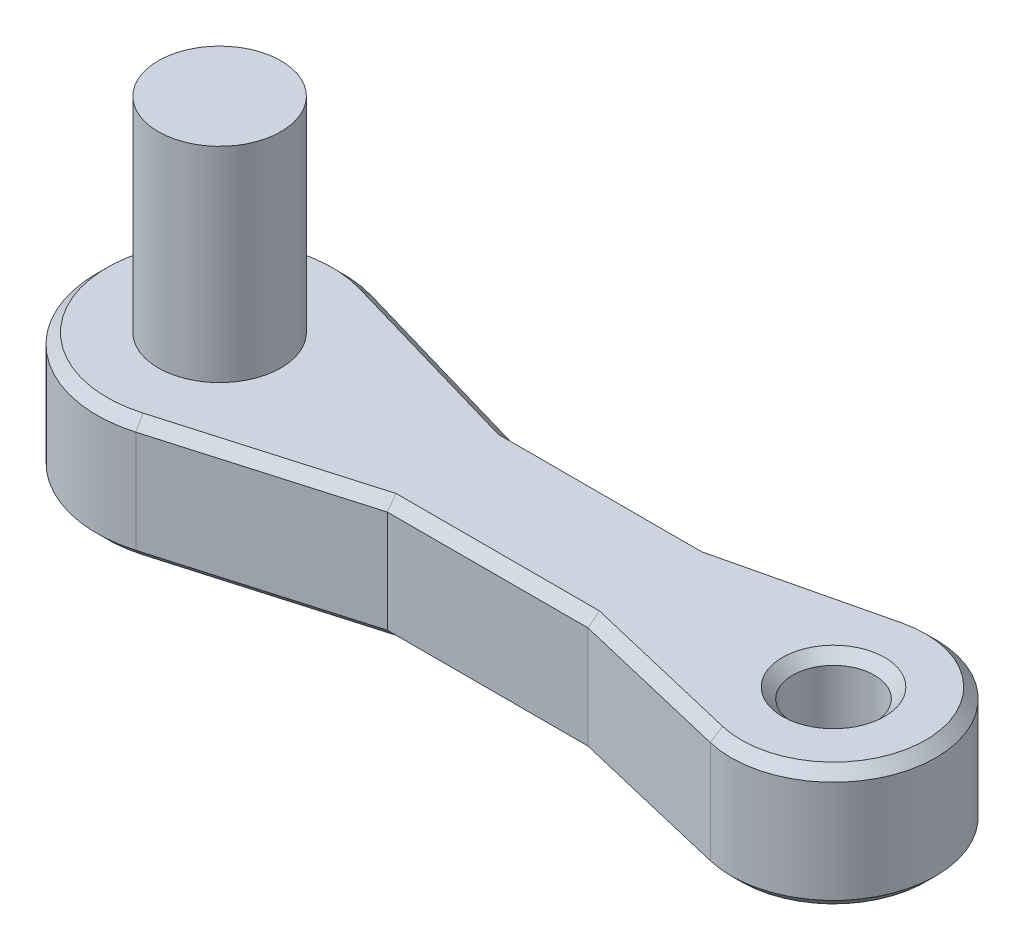
ISO-10303-21;
HEADER;
FILE_DESCRIPTION(('STEP AP214'),'2;1');
FILE_NAME('part.step','',(''),(''),'','','');
FILE_SCHEMA(('AUTOMOTIVE_DESIGN { 1 0 10303 214 1 1 1 1 }'));
ENDSEC;
DATA;
#1=APPLICATION_CONTEXT('core data for automotive mechanical design processes');
#2=APPLICATION_PROTOCOL_DEFINITION('international standard','automotive_design',2000,#1);
#3=PRODUCT_CONTEXT('',#1,'mechanical');
#4=PRODUCT('Part','Part','',(#3));
#5=PRODUCT_RELATED_PRODUCT_CATEGORY('part','',(#4));
#6=PRODUCT_DEFINITION_FORMATION('','',#4);
#7=PRODUCT_DEFINITION_CONTEXT('part definition',#1,'design');
#8=PRODUCT_DEFINITION('design','',#6,#7);
#9=PRODUCT_DEFINITION_SHAPE('','',#8);
#10=(LENGTH_UNIT() NAMED_UNIT(*) SI_UNIT(.MILLI.,.METRE.));
#11=(NAMED_UNIT(*) PLANE_ANGLE_UNIT() SI_UNIT($,.RADIAN.));
#12=(NAMED_UNIT(*) SI_UNIT($,.STERADIAN.) SOLID_ANGLE_UNIT());
#13=UNCERTAINTY_MEASURE_WITH_UNIT(LENGTH_MEASURE(1.E-05),#10,'distance_accuracy_value','');
#14=(GEOMETRIC_REPRESENTATION_CONTEXT(3) GLOBAL_UNCERTAINTY_ASSIGNED_CONTEXT((#13)) GLOBAL_UNIT_ASSIGNED_CONTEXT((#10,
#11,#12)) REPRESENTATION_CONTEXT('',''));
#15=CARTESIAN_POINT('',(0.,0.,0.));
#16=DIRECTION('',(0.,0.,1.));
#17=DIRECTION('',(1.,0.,0.));
#18=AXIS2_PLACEMENT_3D('',#15,#16,#17);
#19=CARTESIAN_POINT('',(0.,-3.,0.));
#20=DIRECTION('',(0.,1.,0.));
#21=DIRECTION('',(0.,0.,1.));
#22=AXIS2_PLACEMENT_3D('',#19,#20,#21);
#23=CYLINDRICAL_SURFACE('',#22,3.);
#24=DIRECTION('',(0.,1.,0.));
#25=VECTOR('',#24,1.);
#26=CARTESIAN_POINT('',(0.835663525696562,-7.95867495084321,2.88126126406829));
#27=LINE('',#26,#25);
#28=CARTESIAN_POINT('',(0.835663525696562,-2.75,2.88126126406829));
#29=VERTEX_POINT('',#28);
#30=CARTESIAN_POINT('',(0.835663525696562,-0.25,2.88126126406829));
#31=VERTEX_POINT('',#30);
#32=EDGE_CURVE('E187',#29,#31,#27,.T.);
#33=ORIENTED_EDGE('',*,*,#32,.T.);
#34=CARTESIAN_POINT('',(0.,-0.25,0.));
#35=DIRECTION('',(0.,1.,0.));
#36=DIRECTION('',(0.,0.,1.));
#37=AXIS2_PLACEMENT_3D('',#34,#35,#36);
#38=CIRCLE('',#37,3.);
#39=CARTESIAN_POINT('',(0.835663525696563,-0.25,-2.88126126406829));
#40=VERTEX_POINT('',#39);
#41=EDGE_CURVE('E305',#31,#40,#38,.F.);
#42=ORIENTED_EDGE('',*,*,#41,.T.);
#43=DIRECTION('',(0.,1.,0.));
#44=VECTOR('',#43,1.);
#45=CARTESIAN_POINT('',(0.835663525696563,-7.95867495084321,-2.88126126406829));
#46=LINE('',#45,#44);
#47=CARTESIAN_POINT('',(0.835663525696563,-2.75,-2.88126126406829));
#48=VERTEX_POINT('',#47);
#49=EDGE_CURVE('E304',#48,#40,#46,.T.);
#50=ORIENTED_EDGE('',*,*,#49,.F.);
#51=CARTESIAN_POINT('',(0.,-2.75,0.));
#52=DIRECTION('',(0.,1.,0.));
#53=DIRECTION('',(0.,0.,1.));
#54=AXIS2_PLACEMENT_3D('',#51,#52,#53);
#55=CIRCLE('',#54,3.);
#56=EDGE_CURVE('E301',#48,#29,#55,.T.);
#57=ORIENTED_EDGE('',*,*,#56,.T.);
#58=EDGE_LOOP('',(#33,#42,#50,#57));
#59=FACE_BOUND('',#58,.T.);
#60=ADVANCED_FACE('F41',(#59),#23,.T.);
#61=CARTESIAN_POINT('',(15.,-3.,0.));
#62=DIRECTION('',(0.,1.,0.));
#63=DIRECTION('',(0.,0.,1.));
#64=AXIS2_PLACEMENT_3D('',#61,#62,#63);
#65=CYLINDRICAL_SURFACE('',#64,2.5);
#66=DIRECTION('',(0.,1.,0.));
#67=VECTOR('',#66,1.);
#68=CARTESIAN_POINT('',(14.4218548123582,-7.03112887414927,-2.4322311037413));
#69=LINE('',#68,#67);
#70=CARTESIAN_POINT('',(14.4218548123582,-2.75,-2.4322311037413));
#71=VERTEX_POINT('',#70);
#72=CARTESIAN_POINT('',(14.4218548123582,-0.25,-2.4322311037413));
#73=VERTEX_POINT('',#72);
#74=EDGE_CURVE('E315',#71,#73,#69,.T.);
#75=ORIENTED_EDGE('',*,*,#74,.T.);
#76=CARTESIAN_POINT('',(15.,-0.25,0.));
#77=DIRECTION('',(0.,1.,0.));
#78=DIRECTION('',(0.,0.,1.));
#79=AXIS2_PLACEMENT_3D('',#76,#77,#78);
#80=CIRCLE('',#79,2.5);
#81=CARTESIAN_POINT('',(14.4218548123582,-0.25,2.4322311037413));
#82=VERTEX_POINT('',#81);
#83=EDGE_CURVE('E264',#73,#82,#80,.F.);
#84=ORIENTED_EDGE('',*,*,#83,.T.);
#85=DIRECTION('',(0.,1.,0.));
#86=VECTOR('',#85,1.);
#87=CARTESIAN_POINT('',(14.4218548123582,-7.03112887414927,2.4322311037413));
#88=LINE('',#87,#86);
#89=CARTESIAN_POINT('',(14.4218548123582,-2.75,2.4322311037413));
#90=VERTEX_POINT('',#89);
#91=EDGE_CURVE('E324',#90,#82,#88,.T.);
#92=ORIENTED_EDGE('',*,*,#91,.F.);
#93=CARTESIAN_POINT('',(15.,-2.75,0.));
#94=DIRECTION('',(0.,1.,0.));
#95=DIRECTION('',(0.,0.,1.));
#96=AXIS2_PLACEMENT_3D('',#93,#94,#95);
#97=CIRCLE('',#96,2.5);
#98=EDGE_CURVE('E262',#90,#71,#97,.T.);
#99=ORIENTED_EDGE('',*,*,#98,.T.);
#100=EDGE_LOOP('',(#75,#84,#92,#99));
#101=FACE_BOUND('',#100,.T.);
#102=ADVANCED_FACE('F375',(#101),#65,.T.);
#103=CARTESIAN_POINT('',(0.,5.,0.));
#104=DIRECTION('',(0.,-1.,0.));
#105=DIRECTION('',(0.,0.,-1.));
#106=AXIS2_PLACEMENT_3D('',#103,#104,#105);
#107=CYLINDRICAL_SURFACE('',#106,1.5);
#108=CARTESIAN_POINT('',(0.,5.,0.));
#109=DIRECTION('',(0.,1.,0.));
#110=DIRECTION('',(0.,0.,1.));
#111=AXIS2_PLACEMENT_3D('',#108,#109,#110);
#112=CIRCLE('',#111,1.5);
#113=CARTESIAN_POINT('',(0.,5.,1.5));
#114=VERTEX_POINT('',#113);
#115=EDGE_CURVE('E329',#114,#114,#112,.T.);
#116=ORIENTED_EDGE('',*,*,#115,.F.);
#117=EDGE_LOOP('',(#116));
#118=FACE_BOUND('',#117,.T.);
#119=CARTESIAN_POINT('',(0.,0.,0.));
#120=DIRECTION('',(0.,1.,0.));
#121=DIRECTION('',(0.,0.,1.));
#122=AXIS2_PLACEMENT_3D('',#119,#120,#121);
#123=CIRCLE('',#122,1.5);
#124=CARTESIAN_POINT('',(0.,0.,1.5));
#125=VERTEX_POINT('',#124);
#126=EDGE_CURVE('E327',#125,#125,#123,.T.);
#127=ORIENTED_EDGE('',*,*,#126,.T.);
#128=EDGE_LOOP('',(#127));
#129=FACE_BOUND('',#128,.T.);
#130=ADVANCED_FACE('F405',(#118,#129),#107,.T.);
#131=CARTESIAN_POINT('',(0.,5.,0.));
#132=DIRECTION('',(0.,1.,0.));
#133=DIRECTION('',(0.,0.,1.));
#134=AXIS2_PLACEMENT_3D('',#131,#132,#133);
#135=PLANE('',#134);
#136=ORIENTED_EDGE('',*,*,#115,.T.);
#137=EDGE_LOOP('',(#136));
#138=FACE_BOUND('',#137,.T.);
#139=ADVANCED_FACE('F410',(#138),#135,.T.);
#140=CARTESIAN_POINT('',(2.59807621135332,-3.,-1.5));
#141=DIRECTION('',(0.,0.,-1.));
#142=DIRECTION('',(-1.,0.,0.));
#143=AXIS2_PLACEMENT_3D('',#140,#141,#142);
#144=PLANE('',#143);
#145=DIRECTION('',(0.,1.,0.));
#146=VECTOR('',#145,1.);
#147=CARTESIAN_POINT('',(5.59807621135332,-7.95867495084321,-1.5));
#148=LINE('',#147,#146);
#149=CARTESIAN_POINT('',(5.59807621135332,-2.75,-1.5));
#150=VERTEX_POINT('',#149);
#151=CARTESIAN_POINT('',(5.59807621135332,-0.25,-1.5));
#152=VERTEX_POINT('',#151);
#153=EDGE_CURVE('E311',#150,#152,#148,.T.);
#154=ORIENTED_EDGE('',*,*,#153,.T.);
#155=DIRECTION('',(1.,0.,0.));
#156=VECTOR('',#155,1.);
#157=CARTESIAN_POINT('',(2.59807621135332,-0.25,-1.5));
#158=LINE('',#157,#156);
#159=CARTESIAN_POINT('',(10.5,-0.250000000000001,-1.5));
#160=VERTEX_POINT('',#159);
#161=EDGE_CURVE('E248',#152,#160,#158,.T.);
#162=ORIENTED_EDGE('',*,*,#161,.T.);
#163=DIRECTION('',(0.,1.,0.));
#164=VECTOR('',#163,1.);
#165=CARTESIAN_POINT('',(10.5,-7.03112887414927,-1.5));
#166=LINE('',#165,#164);
#167=CARTESIAN_POINT('',(10.5,-2.75,-1.5));
#168=VERTEX_POINT('',#167);
#169=EDGE_CURVE('E318',#168,#160,#166,.T.);
#170=ORIENTED_EDGE('',*,*,#169,.F.);
#171=DIRECTION('',(-1.,0.,0.));
#172=VECTOR('',#171,1.);
#173=CARTESIAN_POINT('',(5.59807621135332,-2.75,-1.5));
#174=LINE('',#173,#172);
#175=EDGE_CURVE('E245',#168,#150,#174,.T.);
#176=ORIENTED_EDGE('',*,*,#175,.T.);
#177=EDGE_LOOP('',(#154,#162,#170,#176));
#178=FACE_BOUND('',#177,.T.);
#179=ADVANCED_FACE('F358',(#178),#144,.T.);
#180=CARTESIAN_POINT('',(2.59807621135332,-3.,1.5));
#181=DIRECTION('',(0.,0.,1.));
#182=DIRECTION('',(1.,0.,0.));
#183=AXIS2_PLACEMENT_3D('',#180,#181,#182);
#184=PLANE('',#183);
#185=DIRECTION('',(0.,1.,0.));
#186=VECTOR('',#185,1.);
#187=CARTESIAN_POINT('',(10.5,-7.03112887414927,1.5));
#188=LINE('',#187,#186);
#189=CARTESIAN_POINT('',(10.5,-2.75,1.5));
#190=VERTEX_POINT('',#189);
#191=CARTESIAN_POINT('',(10.5,-0.25,1.5));
#192=VERTEX_POINT('',#191);
#193=EDGE_CURVE('E321',#190,#192,#188,.T.);
#194=ORIENTED_EDGE('',*,*,#193,.T.);
#195=DIRECTION('',(-1.,0.,0.));
#196=VECTOR('',#195,1.);
#197=CARTESIAN_POINT('',(2.59807621135332,-0.25,1.5));
#198=LINE('',#197,#196);
#199=CARTESIAN_POINT('',(5.59807621135332,-0.25,1.5));
#200=VERTEX_POINT('',#199);
#201=EDGE_CURVE('E239',#192,#200,#198,.T.);
#202=ORIENTED_EDGE('',*,*,#201,.T.);
#203=DIRECTION('',(0.,1.,0.));
#204=VECTOR('',#203,1.);
#205=CARTESIAN_POINT('',(5.59807621135332,-7.95867495084321,1.5));
#206=LINE('',#205,#204);
#207=CARTESIAN_POINT('',(5.59807621135332,-2.75,1.5));
#208=VERTEX_POINT('',#207);
#209=EDGE_CURVE('E309',#208,#200,#206,.T.);
#210=ORIENTED_EDGE('',*,*,#209,.F.);
#211=DIRECTION('',(1.,0.,0.));
#212=VECTOR('',#211,1.);
#213=CARTESIAN_POINT('',(10.5,-2.75,1.5));
#214=LINE('',#213,#212);
#215=EDGE_CURVE('E246',#208,#190,#214,.T.);
#216=ORIENTED_EDGE('',*,*,#215,.T.);
#217=EDGE_LOOP('',(#194,#202,#210,#216));
#218=FACE_BOUND('',#217,.T.);
#219=ADVANCED_FACE('F409',(#218),#184,.T.);
#220=CARTESIAN_POINT('',(0.,-3.,0.));
#221=DIRECTION('',(0.,1.,0.));
#222=DIRECTION('',(0.,0.,1.));
#223=AXIS2_PLACEMENT_3D('',#220,#221,#222);
#224=PLANE('',#223);
#225=CARTESIAN_POINT('',(15.,-3.,0.));
#226=DIRECTION('',(0.,1.,0.));
#227=DIRECTION('',(0.,0.,1.));
#228=AXIS2_PLACEMENT_3D('',#225,#226,#227);
#229=CIRCLE('',#228,1.25);
#230=CARTESIAN_POINT('',(15.,-3.,1.25));
#231=VERTEX_POINT('',#230);
#232=EDGE_CURVE('E11',#231,#231,#229,.T.);
#233=ORIENTED_EDGE('',*,*,#232,.T.);
#234=EDGE_LOOP('',(#233));
#235=FACE_BOUND('',#234,.T.);
#236=DIRECTION('',(-0.960420421356096,0.,0.278554508565521));
#237=VECTOR('',#236,1.);
#238=CARTESIAN_POINT('',(0.766024898555182,-3.,2.64115615872926));
#239=LINE('',#238,#237);
#240=CARTESIAN_POINT('',(5.56255391910275,-3.,1.25));
#241=VERTEX_POINT('',#240);
#242=CARTESIAN_POINT('',(0.766024898555181,-3.,2.64115615872926));
#243=VERTEX_POINT('',#242);
#244=EDGE_CURVE('E67',#241,#243,#239,.T.);
#245=ORIENTED_EDGE('',*,*,#244,.T.);
#246=CARTESIAN_POINT('',(0.,-3.,0.));
#247=DIRECTION('',(0.,1.,0.));
#248=DIRECTION('',(0.,0.,1.));
#249=AXIS2_PLACEMENT_3D('',#246,#247,#248);
#250=CIRCLE('',#249,2.75);
#251=CARTESIAN_POINT('',(0.766024898555182,-3.,-2.64115615872926));
#252=VERTEX_POINT('',#251);
#253=EDGE_CURVE('E51',#243,#252,#250,.F.);
#254=ORIENTED_EDGE('',*,*,#253,.T.);
#255=DIRECTION('',(0.960420421356096,0.,0.278554508565521));
#256=VECTOR('',#255,1.);
#257=CARTESIAN_POINT('',(5.52843758421194,-3.,-1.25989489466097));
#258=LINE('',#257,#256);
#259=CARTESIAN_POINT('',(5.56255391910275,-3.,-1.25));
#260=VERTEX_POINT('',#259);
#261=EDGE_CURVE('E283',#252,#260,#258,.T.);
#262=ORIENTED_EDGE('',*,*,#261,.T.);
#263=DIRECTION('',(1.,0.,0.));
#264=VECTOR('',#263,1.);
#265=CARTESIAN_POINT('',(10.5,-3.,-1.25));
#266=LINE('',#265,#264);
#267=CARTESIAN_POINT('',(10.5293044453657,-3.,-1.25));
#268=VERTEX_POINT('',#267);
#269=EDGE_CURVE('E278',#260,#268,#266,.T.);
#270=ORIENTED_EDGE('',*,*,#269,.T.);
#271=DIRECTION('',(0.972892441496522,0.,-0.231258075056715));
#272=VECTOR('',#271,1.);
#273=CARTESIAN_POINT('',(14.4796693311224,-3.,-2.18900799336717));
#274=LINE('',#273,#272);
#275=CARTESIAN_POINT('',(14.4796693311224,-3.,-2.18900799336717));
#276=VERTEX_POINT('',#275);
#277=EDGE_CURVE('E276',#268,#276,#274,.T.);
#278=ORIENTED_EDGE('',*,*,#277,.T.);
#279=CARTESIAN_POINT('',(15.,-3.,0.));
#280=DIRECTION('',(0.,1.,0.));
#281=DIRECTION('',(0.,0.,1.));
#282=AXIS2_PLACEMENT_3D('',#279,#280,#281);
#283=CIRCLE('',#282,2.25);
#284=CARTESIAN_POINT('',(14.4796693311224,-3.,2.18900799336717));
#285=VERTEX_POINT('',#284);
#286=EDGE_CURVE('E272',#276,#285,#283,.F.);
#287=ORIENTED_EDGE('',*,*,#286,.T.);
#288=DIRECTION('',(-0.972892441496522,0.,-0.231258075056715));
#289=VECTOR('',#288,1.);
#290=CARTESIAN_POINT('',(10.5578145187642,-3.,1.25677688962587));
#291=LINE('',#290,#289);
#292=CARTESIAN_POINT('',(10.5293044453657,-3.,1.25));
#293=VERTEX_POINT('',#292);
#294=EDGE_CURVE('E274',#285,#293,#291,.T.);
#295=ORIENTED_EDGE('',*,*,#294,.T.);
#296=DIRECTION('',(-1.,0.,0.));
#297=VECTOR('',#296,1.);
#298=CARTESIAN_POINT('',(5.59807621135332,-3.,1.25));
#299=LINE('',#298,#297);
#300=EDGE_CURVE('E280',#293,#241,#299,.T.);
#301=ORIENTED_EDGE('',*,*,#300,.T.);
#302=EDGE_LOOP('',(#245,#254,#262,#270,#278,#287,#295,#301));
#303=FACE_BOUND('',#302,.T.);
#304=ADVANCED_FACE('F284',(#235,#303),#224,.F.);
#305=CARTESIAN_POINT('',(0.,0.,0.));
#306=DIRECTION('',(0.,1.,0.));
#307=DIRECTION('',(0.,0.,1.));
#308=AXIS2_PLACEMENT_3D('',#305,#306,#307);
#309=PLANE('',#308);
#310=DIRECTION('',(-0.960420421356096,0.,-0.278554508565521));
#311=VECTOR('',#310,1.);
#312=CARTESIAN_POINT('',(0.766024898555183,0.,-2.64115615872926));
#313=LINE('',#312,#311);
#314=CARTESIAN_POINT('',(5.56255391910275,0.,-1.25));
#315=VERTEX_POINT('',#314);
#316=CARTESIAN_POINT('',(0.766024898555183,0.,-2.64115615872926));
#317=VERTEX_POINT('',#316);
#318=EDGE_CURVE('E342',#315,#317,#313,.T.);
#319=ORIENTED_EDGE('',*,*,#318,.T.);
#320=CARTESIAN_POINT('',(0.,0.,0.));
#321=DIRECTION('',(0.,1.,0.));
#322=DIRECTION('',(0.,0.,1.));
#323=AXIS2_PLACEMENT_3D('',#320,#321,#322);
#324=CIRCLE('',#323,2.75);
#325=CARTESIAN_POINT('',(0.766024898555182,0.,2.64115615872926));
#326=VERTEX_POINT('',#325);
#327=EDGE_CURVE('E306',#317,#326,#324,.T.);
#328=ORIENTED_EDGE('',*,*,#327,.T.);
#329=DIRECTION('',(0.960420421356096,0.,-0.278554508565521));
#330=VECTOR('',#329,1.);
#331=CARTESIAN_POINT('',(0.766024898555182,0.,2.64115615872926));
#332=LINE('',#331,#330);
#333=CARTESIAN_POINT('',(5.56255391910275,0.,1.25));
#334=VERTEX_POINT('',#333);
#335=EDGE_CURVE('E340',#326,#334,#332,.T.);
#336=ORIENTED_EDGE('',*,*,#335,.T.);
#337=DIRECTION('',(1.,0.,0.));
#338=VECTOR('',#337,1.);
#339=CARTESIAN_POINT('',(0.,0.,1.25));
#340=LINE('',#339,#338);
#341=CARTESIAN_POINT('',(10.5293044453657,0.,1.25));
#342=VERTEX_POINT('',#341);
#343=EDGE_CURVE('E165',#334,#342,#340,.T.);
#344=ORIENTED_EDGE('',*,*,#343,.T.);
#345=DIRECTION('',(0.972892441496522,0.,0.231258075056715));
#346=VECTOR('',#345,1.);
#347=CARTESIAN_POINT('',(0.28187379030645,0.,-1.18583050549853));
#348=LINE('',#347,#346);
#349=CARTESIAN_POINT('',(14.4796693311224,0.,2.18900799336717));
#350=VERTEX_POINT('',#349);
#351=EDGE_CURVE('E158',#342,#350,#348,.T.);
#352=ORIENTED_EDGE('',*,*,#351,.T.);
#353=CARTESIAN_POINT('',(15.,0.,0.));
#354=DIRECTION('',(0.,1.,0.));
#355=DIRECTION('',(0.,0.,1.));
#356=AXIS2_PLACEMENT_3D('',#353,#354,#355);
#357=CIRCLE('',#356,2.25);
#358=CARTESIAN_POINT('',(14.4796693311224,0.,-2.18900799336717));
#359=VERTEX_POINT('',#358);
#360=EDGE_CURVE('E162',#350,#359,#357,.T.);
#361=ORIENTED_EDGE('',*,*,#360,.T.);
#362=DIRECTION('',(-0.972892441496522,0.,0.231258075056715));
#363=VECTOR('',#362,1.);
#364=CARTESIAN_POINT('',(0.281873790306449,0.,1.18583050549852));
#365=LINE('',#364,#363);
#366=CARTESIAN_POINT('',(10.5293044453657,0.,-1.25));
#367=VERTEX_POINT('',#366);
#368=EDGE_CURVE('E170',#359,#367,#365,.T.);
#369=ORIENTED_EDGE('',*,*,#368,.T.);
#370=DIRECTION('',(-1.,0.,0.));
#371=VECTOR('',#370,1.);
#372=CARTESIAN_POINT('',(0.,0.,-1.25));
#373=LINE('',#372,#371);
#374=EDGE_CURVE('E337',#367,#315,#373,.T.);
#375=ORIENTED_EDGE('',*,*,#374,.T.);
#376=EDGE_LOOP('',(#319,#328,#336,#344,#352,#361,#369,#375));
#377=FACE_BOUND('',#376,.T.);
#378=CARTESIAN_POINT('',(15.,0.,0.));
#379=DIRECTION('',(0.,1.,0.));
#380=DIRECTION('',(0.,0.,1.));
#381=AXIS2_PLACEMENT_3D('',#378,#379,#380);
#382=CIRCLE('',#381,1.25);
#383=CARTESIAN_POINT('',(15.,0.,1.25));
#384=VERTEX_POINT('',#383);
#385=EDGE_CURVE('E181',#384,#384,#382,.F.);
#386=ORIENTED_EDGE('',*,*,#385,.T.);
#387=EDGE_LOOP('',(#386));
#388=FACE_BOUND('',#387,.T.);
#389=ORIENTED_EDGE('',*,*,#126,.F.);
#390=EDGE_LOOP('',(#389));
#391=FACE_BOUND('',#390,.T.);
#392=ADVANCED_FACE('F160',(#377,#388,#391),#309,.T.);
#393=CARTESIAN_POINT('',(15.,-5.82842712474619,0.));
#394=DIRECTION('',(0.,1.,0.));
#395=DIRECTION('',(0.,0.,1.));
#396=AXIS2_PLACEMENT_3D('',#393,#394,#395);
#397=CYLINDRICAL_SURFACE('',#396,1.);
#398=CARTESIAN_POINT('',(15.,-2.75,0.));
#399=DIRECTION('',(0.,1.,0.));
#400=DIRECTION('',(0.,0.,1.));
#401=AXIS2_PLACEMENT_3D('',#398,#399,#400);
#402=CIRCLE('',#401,1.);
#403=CARTESIAN_POINT('',(15.,-2.75,1.));
#404=VERTEX_POINT('',#403);
#405=EDGE_CURVE('E269',#404,#404,#402,.F.);
#406=ORIENTED_EDGE('',*,*,#405,.T.);
#407=EDGE_LOOP('',(#406));
#408=FACE_BOUND('',#407,.T.);
#409=CARTESIAN_POINT('',(15.,-0.249999999999999,0.));
#410=DIRECTION('',(0.,1.,0.));
#411=DIRECTION('',(0.,0.,1.));
#412=AXIS2_PLACEMENT_3D('',#409,#410,#411);
#413=CIRCLE('',#412,1.);
#414=CARTESIAN_POINT('',(15.,-0.249999999999999,1.));
#415=VERTEX_POINT('',#414);
#416=EDGE_CURVE('E266',#415,#415,#413,.T.);
#417=ORIENTED_EDGE('',*,*,#416,.T.);
#418=EDGE_LOOP('',(#417));
#419=FACE_BOUND('',#418,.T.);
#420=ADVANCED_FACE('F532',(#408,#419),#397,.F.);
#421=CARTESIAN_POINT('',(10.5,-7.03112887414927,1.5));
#422=DIRECTION('',(-0.231258075056715,0.,0.972892441496522));
#423=DIRECTION('',(0.972892441496522,0.,0.231258075056715));
#424=AXIS2_PLACEMENT_3D('',#421,#422,#423);
#425=PLANE('',#424);
#426=ORIENTED_EDGE('',*,*,#91,.T.);
#427=DIRECTION('',(-0.972892441496522,0.,-0.231258075056715));
#428=VECTOR('',#427,1.);
#429=CARTESIAN_POINT('',(10.5,-0.25,1.5));
#430=LINE('',#429,#428);
#431=EDGE_CURVE('E184',#82,#192,#430,.T.);
#432=ORIENTED_EDGE('',*,*,#431,.T.);
#433=ORIENTED_EDGE('',*,*,#193,.F.);
#434=DIRECTION('',(0.972892441496522,0.,0.231258075056715));
#435=VECTOR('',#434,1.);
#436=CARTESIAN_POINT('',(14.4218548123582,-2.75,2.4322311037413));
#437=LINE('',#436,#435);
#438=EDGE_CURVE('E259',#190,#90,#437,.T.);
#439=ORIENTED_EDGE('',*,*,#438,.T.);
#440=EDGE_LOOP('',(#426,#432,#433,#439));
#441=FACE_BOUND('',#440,.T.);
#442=ADVANCED_FACE('F534',(#441),#425,.T.);
#443=CARTESIAN_POINT('',(10.5,-7.03112887414927,-1.5));
#444=DIRECTION('',(-0.231258075056715,0.,-0.972892441496522));
#445=DIRECTION('',(-0.972892441496522,0.,0.231258075056715));
#446=AXIS2_PLACEMENT_3D('',#443,#444,#445);
#447=PLANE('',#446);
#448=ORIENTED_EDGE('',*,*,#169,.T.);
#449=DIRECTION('',(0.972892441496522,0.,-0.231258075056715));
#450=VECTOR('',#449,1.);
#451=CARTESIAN_POINT('',(10.5,-0.250000000000001,-1.5));
#452=LINE('',#451,#450);
#453=EDGE_CURVE('E257',#160,#73,#452,.T.);
#454=ORIENTED_EDGE('',*,*,#453,.T.);
#455=ORIENTED_EDGE('',*,*,#74,.F.);
#456=DIRECTION('',(-0.972892441496522,0.,0.231258075056715));
#457=VECTOR('',#456,1.);
#458=CARTESIAN_POINT('',(10.5,-2.75,-1.5));
#459=LINE('',#458,#457);
#460=EDGE_CURVE('E255',#71,#168,#459,.T.);
#461=ORIENTED_EDGE('',*,*,#460,.T.);
#462=EDGE_LOOP('',(#448,#454,#455,#461));
#463=FACE_BOUND('',#462,.T.);
#464=ADVANCED_FACE('F373',(#463),#447,.T.);
#465=CARTESIAN_POINT('',(5.59807621135332,-7.95867495084321,-1.5));
#466=DIRECTION('',(0.278554508565521,0.,-0.960420421356096));
#467=DIRECTION('',(-0.960420421356096,0.,-0.278554508565521));
#468=AXIS2_PLACEMENT_3D('',#465,#466,#467);
#469=PLANE('',#468);
#470=ORIENTED_EDGE('',*,*,#49,.T.);
#471=DIRECTION('',(0.960420421356096,0.,0.278554508565521));
#472=VECTOR('',#471,1.);
#473=CARTESIAN_POINT('',(5.59807621135332,-0.25,-1.5));
#474=LINE('',#473,#472);
#475=EDGE_CURVE('E296',#40,#152,#474,.T.);
#476=ORIENTED_EDGE('',*,*,#475,.T.);
#477=ORIENTED_EDGE('',*,*,#153,.F.);
#478=DIRECTION('',(-0.960420421356096,0.,-0.278554508565521));
#479=VECTOR('',#478,1.);
#480=CARTESIAN_POINT('',(0.835663525696564,-2.75,-2.88126126406829));
#481=LINE('',#480,#479);
#482=EDGE_CURVE('E347',#150,#48,#481,.T.);
#483=ORIENTED_EDGE('',*,*,#482,.T.);
#484=EDGE_LOOP('',(#470,#476,#477,#483));
#485=FACE_BOUND('',#484,.T.);
#486=ADVANCED_FACE('F352',(#485),#469,.T.);
#487=CARTESIAN_POINT('',(5.59807621135332,-7.95867495084321,1.5));
#488=DIRECTION('',(0.278554508565521,0.,0.960420421356096));
#489=DIRECTION('',(0.960420421356096,0.,-0.278554508565521));
#490=AXIS2_PLACEMENT_3D('',#487,#488,#489);
#491=PLANE('',#490);
#492=ORIENTED_EDGE('',*,*,#209,.T.);
#493=DIRECTION('',(-0.960420421356096,0.,0.278554508565521));
#494=VECTOR('',#493,1.);
#495=CARTESIAN_POINT('',(5.59807621135332,-0.25,1.5));
#496=LINE('',#495,#494);
#497=EDGE_CURVE('E250',#200,#31,#496,.T.);
#498=ORIENTED_EDGE('',*,*,#497,.T.);
#499=ORIENTED_EDGE('',*,*,#32,.F.);
#500=DIRECTION('',(0.960420421356096,0.,-0.278554508565521));
#501=VECTOR('',#500,1.);
#502=CARTESIAN_POINT('',(5.59807621135332,-2.75,1.5));
#503=LINE('',#502,#501);
#504=EDGE_CURVE('E291',#29,#208,#503,.T.);
#505=ORIENTED_EDGE('',*,*,#504,.T.);
#506=EDGE_LOOP('',(#492,#498,#499,#505));
#507=FACE_BOUND('',#506,.T.);
#508=ADVANCED_FACE('F308',(#507),#491,.T.);
#509=CARTESIAN_POINT('',(15.,0.,0.));
#510=DIRECTION('',(0.,-1.,0.));
#511=DIRECTION('',(0.,0.,-1.));
#512=AXIS2_PLACEMENT_3D('',#509,#510,#511);
#513=CONICAL_SURFACE('',#512,2.25,0.785398163397449);
#514=DIRECTION('',(0.163524153076751,0.707106781186547,-0.687938842747328));
#515=VECTOR('',#514,1.);
#516=CARTESIAN_POINT('',(14.4218548123582,-0.25,2.4322311037413));
#517=LINE('',#516,#515);
#518=EDGE_CURVE('E176',#82,#350,#517,.T.);
#519=ORIENTED_EDGE('',*,*,#518,.F.);
#520=ORIENTED_EDGE('',*,*,#83,.F.);
#521=DIRECTION('',(-0.163524153076751,-0.707106781186547,-0.687938842747328));
#522=VECTOR('',#521,1.);
#523=CARTESIAN_POINT('',(14.4796693311224,0.,-2.18900799336717));
#524=LINE('',#523,#522);
#525=EDGE_CURVE('E179',#359,#73,#524,.T.);
#526=ORIENTED_EDGE('',*,*,#525,.F.);
#527=ORIENTED_EDGE('',*,*,#360,.F.);
#528=EDGE_LOOP('',(#519,#520,#526,#527));
#529=FACE_BOUND('',#528,.T.);
#530=ADVANCED_FACE('F174',(#529),#513,.T.);
#531=CARTESIAN_POINT('',(0.281873790306449,0.,1.18583050549852));
#532=DIRECTION('',(0.163524153076751,-0.707106781186547,0.687938842747327));
#533=DIRECTION('',(-0.972892441496522,0.,0.231258075056715));
#534=AXIS2_PLACEMENT_3D('',#531,#532,#533);
#535=PLANE('',#534);
#536=ORIENTED_EDGE('',*,*,#525,.T.);
#537=ORIENTED_EDGE('',*,*,#453,.F.);
#538=DIRECTION('',(0.0826022349545834,0.704690311690358,0.704690311690359));
#539=VECTOR('',#538,1.);
#540=CARTESIAN_POINT('',(10.4574616405436,-0.612900226617761,-1.86290022661776));
#541=LINE('',#540,#539);
#542=EDGE_CURVE('E185',#367,#160,#541,.F.);
#543=ORIENTED_EDGE('',*,*,#542,.F.);
#544=ORIENTED_EDGE('',*,*,#368,.F.);
#545=EDGE_LOOP('',(#536,#537,#543,#544));
#546=FACE_BOUND('',#545,.T.);
#547=ADVANCED_FACE('F370',(#546),#535,.F.);
#548=CARTESIAN_POINT('',(0.281873790306451,0.,-1.18583050549853));
#549=DIRECTION('',(0.163524153076751,-0.707106781186548,-0.687938842747326));
#550=DIRECTION('',(0.972892441496522,0.,0.231258075056715));
#551=AXIS2_PLACEMENT_3D('',#548,#549,#550);
#552=PLANE('',#551);
#553=ORIENTED_EDGE('',*,*,#518,.T.);
#554=ORIENTED_EDGE('',*,*,#351,.F.);
#555=DIRECTION('',(-0.0826022349545887,-0.704690311690357,0.704690311690358));
#556=VECTOR('',#555,1.);
#557=CARTESIAN_POINT('',(10.4574616405436,-0.612900226617801,1.8629002266178));
#558=LINE('',#557,#556);
#559=EDGE_CURVE('E190',#192,#342,#558,.F.);
#560=ORIENTED_EDGE('',*,*,#559,.F.);
#561=ORIENTED_EDGE('',*,*,#431,.F.);
#562=EDGE_LOOP('',(#553,#554,#560,#561));
#563=FACE_BOUND('',#562,.T.);
#564=ADVANCED_FACE('F183',(#563),#552,.F.);
#565=CARTESIAN_POINT('',(0.,0.,-1.25));
#566=DIRECTION('',(0.,-0.707106781186548,0.707106781186547));
#567=DIRECTION('',(-1.,0.,0.));
#568=AXIS2_PLACEMENT_3D('',#565,#566,#567);
#569=PLANE('',#568);
#570=ORIENTED_EDGE('',*,*,#542,.T.);
#571=ORIENTED_EDGE('',*,*,#161,.F.);
#572=DIRECTION('',(-0.0999689055753826,0.703564573411019,0.70356457341102));
#573=VECTOR('',#572,1.);
#574=CARTESIAN_POINT('',(5.61246483802446,-0.351264767555421,-1.60126476755542));
#575=LINE('',#574,#573);
#576=EDGE_CURVE('E233',#315,#152,#575,.F.);
#577=ORIENTED_EDGE('',*,*,#576,.F.);
#578=ORIENTED_EDGE('',*,*,#374,.F.);
#579=EDGE_LOOP('',(#570,#571,#577,#578));
#580=FACE_BOUND('',#579,.T.);
#581=ADVANCED_FACE('F363',(#580),#569,.F.);
#582=CARTESIAN_POINT('',(0.,0.,1.25));
#583=DIRECTION('',(0.,-0.707106781186548,-0.707106781186547));
#584=DIRECTION('',(1.,0.,0.));
#585=AXIS2_PLACEMENT_3D('',#582,#583,#584);
#586=PLANE('',#585);
#587=ORIENTED_EDGE('',*,*,#559,.T.);
#588=ORIENTED_EDGE('',*,*,#343,.F.);
#589=DIRECTION('',(0.0999689055753851,-0.703564573411019,0.70356457341102));
#590=VECTOR('',#589,1.);
#591=CARTESIAN_POINT('',(5.61246483802447,-0.351264767555411,1.60126476755541));
#592=LINE('',#591,#590);
#593=EDGE_CURVE('E227',#200,#334,#592,.F.);
#594=ORIENTED_EDGE('',*,*,#593,.F.);
#595=ORIENTED_EDGE('',*,*,#201,.F.);
#596=EDGE_LOOP('',(#587,#588,#594,#595));
#597=FACE_BOUND('',#596,.T.);
#598=ADVANCED_FACE('F237',(#597),#586,.F.);
#599=CARTESIAN_POINT('',(0.766024898555183,0.,-2.64115615872926));
#600=DIRECTION('',(-0.196967781936766,-0.707106781186547,0.679119792730937));
#601=DIRECTION('',(-0.960420421356096,0.,-0.278554508565521));
#602=AXIS2_PLACEMENT_3D('',#599,#600,#601);
#603=PLANE('',#602);
#604=ORIENTED_EDGE('',*,*,#576,.T.);
#605=ORIENTED_EDGE('',*,*,#475,.F.);
#606=DIRECTION('',(0.196967781936766,-0.707106781186548,-0.679119792730936));
#607=VECTOR('',#606,1.);
#608=CARTESIAN_POINT('',(0.766024898555183,0.,-2.64115615872926));
#609=LINE('',#608,#607);
#610=EDGE_CURVE('E220',#317,#40,#609,.T.);
#611=ORIENTED_EDGE('',*,*,#610,.F.);
#612=ORIENTED_EDGE('',*,*,#318,.F.);
#613=EDGE_LOOP('',(#604,#605,#611,#612));
#614=FACE_BOUND('',#613,.T.);
#615=ADVANCED_FACE('F367',(#614),#603,.F.);
#616=CARTESIAN_POINT('',(0.766024898555182,0.,2.64115615872926));
#617=DIRECTION('',(-0.196967781936766,-0.707106781186547,-0.679119792730937));
#618=DIRECTION('',(0.960420421356096,0.,-0.278554508565521));
#619=AXIS2_PLACEMENT_3D('',#616,#617,#618);
#620=PLANE('',#619);
#621=ORIENTED_EDGE('',*,*,#593,.T.);
#622=ORIENTED_EDGE('',*,*,#335,.F.);
#623=DIRECTION('',(-0.196967781936766,0.707106781186547,-0.679119792730937));
#624=VECTOR('',#623,1.);
#625=CARTESIAN_POINT('',(0.835663525696562,-0.25,2.88126126406829));
#626=LINE('',#625,#624);
#627=EDGE_CURVE('E215',#31,#326,#626,.T.);
#628=ORIENTED_EDGE('',*,*,#627,.F.);
#629=ORIENTED_EDGE('',*,*,#497,.F.);
#630=EDGE_LOOP('',(#621,#622,#628,#629));
#631=FACE_BOUND('',#630,.T.);
#632=ADVANCED_FACE('F425',(#631),#620,.F.);
#633=CARTESIAN_POINT('',(0.,0.,0.));
#634=DIRECTION('',(0.,-1.,0.));
#635=DIRECTION('',(0.,0.,-1.));
#636=AXIS2_PLACEMENT_3D('',#633,#634,#635);
#637=CONICAL_SURFACE('',#636,2.75,0.785398163397449);
#638=ORIENTED_EDGE('',*,*,#610,.T.);
#639=ORIENTED_EDGE('',*,*,#41,.F.);
#640=ORIENTED_EDGE('',*,*,#627,.T.);
#641=ORIENTED_EDGE('',*,*,#327,.F.);
#642=EDGE_LOOP('',(#638,#639,#640,#641));
#643=FACE_BOUND('',#642,.T.);
#644=ADVANCED_FACE('F417',(#643),#637,.T.);
#645=CARTESIAN_POINT('',(15.,-2.75,0.));
#646=DIRECTION('',(0.,-1.,0.));
#647=DIRECTION('',(0.,0.,-1.));
#648=AXIS2_PLACEMENT_3D('',#645,#646,#647);
#649=CONICAL_SURFACE('',#648,1.,0.785398163397456);
#650=ORIENTED_EDGE('',*,*,#232,.F.);
#651=EDGE_LOOP('',(#650));
#652=FACE_BOUND('',#651,.T.);
#653=ORIENTED_EDGE('',*,*,#405,.F.);
#654=EDGE_LOOP('',(#653));
#655=FACE_BOUND('',#654,.T.);
#656=ADVANCED_FACE('F424',(#652,#655),#649,.F.);
#657=CARTESIAN_POINT('',(15.,-2.75,0.));
#658=DIRECTION('',(0.,1.,0.));
#659=DIRECTION('',(0.,0.,1.));
#660=AXIS2_PLACEMENT_3D('',#657,#658,#659);
#661=CONICAL_SURFACE('',#660,2.5,0.785398163397449);
#662=DIRECTION('',(-0.163524153076749,0.707106781186547,0.687938842747328));
#663=VECTOR('',#662,1.);
#664=CARTESIAN_POINT('',(14.4796693311224,-3.,2.18900799336717));
#665=LINE('',#664,#663);
#666=EDGE_CURVE('E208',#285,#90,#665,.T.);
#667=ORIENTED_EDGE('',*,*,#666,.F.);
#668=ORIENTED_EDGE('',*,*,#286,.F.);
#669=DIRECTION('',(0.163524153076749,-0.707106781186547,0.687938842747328));
#670=VECTOR('',#669,1.);
#671=CARTESIAN_POINT('',(14.4218548123582,-2.75,-2.4322311037413));
#672=LINE('',#671,#670);
#673=EDGE_CURVE('E46',#71,#276,#672,.T.);
#674=ORIENTED_EDGE('',*,*,#673,.F.);
#675=ORIENTED_EDGE('',*,*,#98,.F.);
#676=EDGE_LOOP('',(#667,#668,#674,#675));
#677=FACE_BOUND('',#676,.T.);
#678=ADVANCED_FACE('F379',(#677),#661,.T.);
#679=CARTESIAN_POINT('',(0.28187379030645,-3.,1.18583050549853));
#680=DIRECTION('',(-0.163524153076751,-0.707106781186548,-0.687938842747327));
#681=DIRECTION('',(-0.972892441496522,0.,0.231258075056715));
#682=AXIS2_PLACEMENT_3D('',#679,#680,#681);
#683=PLANE('',#682);
#684=ORIENTED_EDGE('',*,*,#673,.T.);
#685=ORIENTED_EDGE('',*,*,#277,.F.);
#686=DIRECTION('',(-0.0826022349545885,0.704690311690357,-0.704690311690358));
#687=VECTOR('',#686,1.);
#688=CARTESIAN_POINT('',(10.4460841529075,-2.29003696009476,-1.95996303990524));
#689=LINE('',#688,#687);
#690=EDGE_CURVE('E206',#168,#268,#689,.F.);
#691=ORIENTED_EDGE('',*,*,#690,.F.);
#692=ORIENTED_EDGE('',*,*,#460,.F.);
#693=EDGE_LOOP('',(#684,#685,#691,#692));
#694=FACE_BOUND('',#693,.T.);
#695=ADVANCED_FACE('F382',(#694),#683,.T.);
#696=CARTESIAN_POINT('',(0.281873790306451,-3.,-1.18583050549853));
#697=DIRECTION('',(-0.163524153076751,-0.707106781186549,0.687938842747326));
#698=DIRECTION('',(0.972892441496522,0.,0.231258075056715));
#699=AXIS2_PLACEMENT_3D('',#696,#697,#698);
#700=PLANE('',#699);
#701=ORIENTED_EDGE('',*,*,#666,.T.);
#702=ORIENTED_EDGE('',*,*,#438,.F.);
#703=DIRECTION('',(0.0826022349545938,-0.704690311690357,-0.704690311690358));
#704=VECTOR('',#703,1.);
#705=CARTESIAN_POINT('',(10.4460841529075,-2.29003696009473,1.95996303990527));
#706=LINE('',#705,#704);
#707=EDGE_CURVE('E203',#293,#190,#706,.F.);
#708=ORIENTED_EDGE('',*,*,#707,.F.);
#709=ORIENTED_EDGE('',*,*,#294,.F.);
#710=EDGE_LOOP('',(#701,#702,#708,#709));
#711=FACE_BOUND('',#710,.T.);
#712=ADVANCED_FACE('F488',(#711),#700,.T.);
#713=CARTESIAN_POINT('',(2.59807621135332,-2.75,-1.5));
#714=DIRECTION('',(0.,-0.707106781186548,-0.707106781186547));
#715=DIRECTION('',(1.,0.,0.));
#716=AXIS2_PLACEMENT_3D('',#713,#714,#715);
#717=PLANE('',#716);
#718=ORIENTED_EDGE('',*,*,#690,.T.);
#719=ORIENTED_EDGE('',*,*,#269,.F.);
#720=DIRECTION('',(0.0999689055753915,0.703564573411018,-0.70356457341102));
#721=VECTOR('',#720,1.);
#722=CARTESIAN_POINT('',(5.61246483802446,-2.64873523244461,-1.60126476755539));
#723=LINE('',#722,#721);
#724=EDGE_CURVE('E200',#150,#260,#723,.F.);
#725=ORIENTED_EDGE('',*,*,#724,.F.);
#726=ORIENTED_EDGE('',*,*,#175,.F.);
#727=EDGE_LOOP('',(#718,#719,#725,#726));
#728=FACE_BOUND('',#727,.T.);
#729=ADVANCED_FACE('F384',(#728),#717,.T.);
#730=CARTESIAN_POINT('',(2.59807621135332,-2.75,1.5));
#731=DIRECTION('',(0.,-0.707106781186548,0.707106781186547));
#732=DIRECTION('',(-1.,0.,0.));
#733=AXIS2_PLACEMENT_3D('',#730,#731,#732);
#734=PLANE('',#733);
#735=ORIENTED_EDGE('',*,*,#707,.T.);
#736=ORIENTED_EDGE('',*,*,#215,.F.);
#737=DIRECTION('',(-0.0999689055753959,-0.703564573411018,-0.703564573411019));
#738=VECTOR('',#737,1.);
#739=CARTESIAN_POINT('',(5.61246483802447,-2.64873523244463,1.60126476755537));
#740=LINE('',#739,#738);
#741=EDGE_CURVE('E197',#241,#208,#740,.F.);
#742=ORIENTED_EDGE('',*,*,#741,.F.);
#743=ORIENTED_EDGE('',*,*,#300,.F.);
#744=EDGE_LOOP('',(#735,#736,#742,#743));
#745=FACE_BOUND('',#744,.T.);
#746=ADVANCED_FACE('F389',(#745),#734,.T.);
#747=CARTESIAN_POINT('',(0.766024898555182,-3.,-2.64115615872926));
#748=DIRECTION('',(0.196967781936766,-0.707106781186548,-0.679119792730936));
#749=DIRECTION('',(-0.960420421356096,0.,-0.278554508565521));
#750=AXIS2_PLACEMENT_3D('',#747,#748,#749);
#751=PLANE('',#750);
#752=ORIENTED_EDGE('',*,*,#724,.T.);
#753=ORIENTED_EDGE('',*,*,#261,.F.);
#754=DIRECTION('',(-0.196967781936766,-0.707106781186546,0.679119792730938));
#755=VECTOR('',#754,1.);
#756=CARTESIAN_POINT('',(0.835663525696563,-2.75,-2.88126126406829));
#757=LINE('',#756,#755);
#758=EDGE_CURVE('E59',#48,#252,#757,.T.);
#759=ORIENTED_EDGE('',*,*,#758,.F.);
#760=ORIENTED_EDGE('',*,*,#482,.F.);
#761=EDGE_LOOP('',(#752,#753,#759,#760));
#762=FACE_BOUND('',#761,.T.);
#763=ADVANCED_FACE('F387',(#762),#751,.T.);
#764=CARTESIAN_POINT('',(0.766024898555181,-3.,2.64115615872926));
#765=DIRECTION('',(0.196967781936766,-0.707106781186549,0.679119792730936));
#766=DIRECTION('',(0.960420421356096,0.,-0.278554508565521));
#767=AXIS2_PLACEMENT_3D('',#764,#765,#766);
#768=PLANE('',#767);
#769=ORIENTED_EDGE('',*,*,#741,.T.);
#770=ORIENTED_EDGE('',*,*,#504,.F.);
#771=DIRECTION('',(0.196967781936766,0.707106781186545,0.679119792730939));
#772=VECTOR('',#771,1.);
#773=CARTESIAN_POINT('',(0.766024898555181,-3.,2.64115615872926));
#774=LINE('',#773,#772);
#775=EDGE_CURVE('E194',#243,#29,#774,.T.);
#776=ORIENTED_EDGE('',*,*,#775,.F.);
#777=ORIENTED_EDGE('',*,*,#244,.F.);
#778=EDGE_LOOP('',(#769,#770,#776,#777));
#779=FACE_BOUND('',#778,.T.);
#780=ADVANCED_FACE('F290',(#779),#768,.T.);
#781=CARTESIAN_POINT('',(0.,-2.75,0.));
#782=DIRECTION('',(0.,1.,0.));
#783=DIRECTION('',(0.,0.,1.));
#784=AXIS2_PLACEMENT_3D('',#781,#782,#783);
#785=CONICAL_SURFACE('',#784,3.,0.785398163397448);
#786=ORIENTED_EDGE('',*,*,#758,.T.);
#787=ORIENTED_EDGE('',*,*,#253,.F.);
#788=ORIENTED_EDGE('',*,*,#775,.T.);
#789=ORIENTED_EDGE('',*,*,#56,.F.);
#790=EDGE_LOOP('',(#786,#787,#788,#789));
#791=FACE_BOUND('',#790,.T.);
#792=ADVANCED_FACE('F287',(#791),#785,.T.);
#793=CARTESIAN_POINT('',(15.,-0.249999999999999,0.));
#794=DIRECTION('',(0.,1.,0.));
#795=DIRECTION('',(0.,0.,1.));
#796=AXIS2_PLACEMENT_3D('',#793,#794,#795);
#797=CONICAL_SURFACE('',#796,1.,0.785398163397449);
#798=ORIENTED_EDGE('',*,*,#385,.F.);
#799=EDGE_LOOP('',(#798));
#800=FACE_BOUND('',#799,.T.);
#801=ORIENTED_EDGE('',*,*,#416,.F.);
#802=EDGE_LOOP('',(#801));
#803=FACE_BOUND('',#802,.T.);
#804=ADVANCED_FACE('F44',(#800,#803),#797,.F.);
#805=CLOSED_SHELL('',(#60,#102,#130,#139,#179,#219,#304,#392,#420,#442,#464,#486,#508,#530,#547,
#564,#581,#598,#615,#632,#644,#656,#678,#695,#712,#729,#746,#763,#780,#792,#804));
#806=MANIFOLD_SOLID_BREP('B2',#805);
#807=ADVANCED_BREP_SHAPE_REPRESENTATION('',(#18,#806),#14);
#808=SHAPE_DEFINITION_REPRESENTATION(#9,#807);
ENDSEC;
END-ISO-10303-21;
